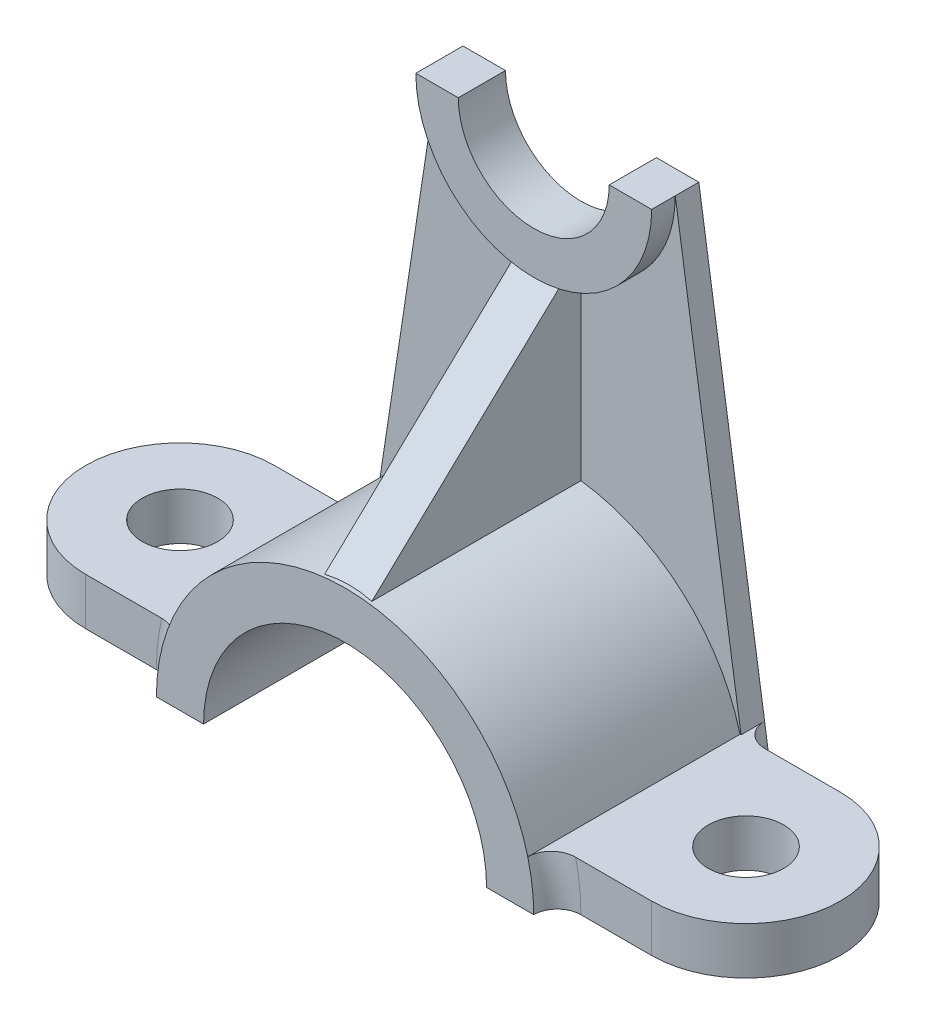
ISO-10303-21;
HEADER;
FILE_DESCRIPTION(('STEP AP214'),'2;1');
FILE_NAME('part.step','',(''),(''),'','','');
FILE_SCHEMA(('AUTOMOTIVE_DESIGN { 1 0 10303 214 1 1 1 1 }'));
ENDSEC;
DATA;
#1=APPLICATION_CONTEXT('core data for automotive mechanical design processes');
#2=APPLICATION_PROTOCOL_DEFINITION('international standard','automotive_design',2000,#1);
#3=PRODUCT_CONTEXT('',#1,'mechanical');
#4=PRODUCT('Part','Part','',(#3));
#5=PRODUCT_RELATED_PRODUCT_CATEGORY('part','',(#4));
#6=PRODUCT_DEFINITION_FORMATION('','',#4);
#7=PRODUCT_DEFINITION_CONTEXT('part definition',#1,'design');
#8=PRODUCT_DEFINITION('design','',#6,#7);
#9=PRODUCT_DEFINITION_SHAPE('','',#8);
#10=(LENGTH_UNIT() NAMED_UNIT(*) SI_UNIT(.MILLI.,.METRE.));
#11=(NAMED_UNIT(*) PLANE_ANGLE_UNIT() SI_UNIT($,.RADIAN.));
#12=(NAMED_UNIT(*) SI_UNIT($,.STERADIAN.) SOLID_ANGLE_UNIT());
#13=UNCERTAINTY_MEASURE_WITH_UNIT(LENGTH_MEASURE(1.E-05),#10,'distance_accuracy_value','');
#14=(GEOMETRIC_REPRESENTATION_CONTEXT(3) GLOBAL_UNCERTAINTY_ASSIGNED_CONTEXT((#13)) GLOBAL_UNIT_ASSIGNED_CONTEXT((#10,
#11,#12)) REPRESENTATION_CONTEXT('',''));
#15=CARTESIAN_POINT('',(0.,0.,0.));
#16=DIRECTION('',(0.,0.,1.));
#17=DIRECTION('',(1.,0.,0.));
#18=AXIS2_PLACEMENT_3D('',#15,#16,#17);
#19=CARTESIAN_POINT('',(-60.,10.,25.));
#20=DIRECTION('',(0.,-1.,0.));
#21=DIRECTION('',(0.,0.,-1.));
#22=AXIS2_PLACEMENT_3D('',#19,#20,#21);
#23=CYLINDRICAL_SURFACE('',#22,20.);
#24=DIRECTION('',(0.,-1.,0.));
#25=VECTOR('',#24,1.);
#26=CARTESIAN_POINT('',(-60.,10.,45.));
#27=LINE('',#26,#25);
#28=CARTESIAN_POINT('',(-60.,10.,45.));
#29=VERTEX_POINT('',#28);
#30=CARTESIAN_POINT('',(-60.,0.,45.));
#31=VERTEX_POINT('',#30);
#32=EDGE_CURVE('E377',#29,#31,#27,.T.);
#33=ORIENTED_EDGE('',*,*,#32,.F.);
#34=CARTESIAN_POINT('',(-60.,10.,25.));
#35=DIRECTION('',(0.,-1.,0.));
#36=DIRECTION('',(0.,0.,-1.));
#37=AXIS2_PLACEMENT_3D('',#34,#35,#36);
#38=CIRCLE('',#37,20.);
#39=CARTESIAN_POINT('',(-60.,10.,5.));
#40=VERTEX_POINT('',#39);
#41=EDGE_CURVE('E517',#40,#29,#38,.F.);
#42=ORIENTED_EDGE('',*,*,#41,.F.);
#43=DIRECTION('',(0.,-1.,0.));
#44=VECTOR('',#43,1.);
#45=CARTESIAN_POINT('',(-60.,10.,5.));
#46=LINE('',#45,#44);
#47=CARTESIAN_POINT('',(-60.,0.,5.));
#48=VERTEX_POINT('',#47);
#49=EDGE_CURVE('E520',#48,#40,#46,.F.);
#50=ORIENTED_EDGE('',*,*,#49,.F.);
#51=CARTESIAN_POINT('',(-60.,0.,25.));
#52=DIRECTION('',(0.,-1.,0.));
#53=DIRECTION('',(1.,0.,0.));
#54=AXIS2_PLACEMENT_3D('',#51,#52,#53);
#55=CIRCLE('',#54,20.);
#56=EDGE_CURVE('E515',#31,#48,#55,.T.);
#57=ORIENTED_EDGE('',*,*,#56,.F.);
#58=EDGE_LOOP('',(#33,#42,#50,#57));
#59=FACE_BOUND('',#58,.T.);
#60=ADVANCED_FACE('F35',(#59),#23,.T.);
#61=CARTESIAN_POINT('',(0.,102.,5.));
#62=DIRECTION('',(0.,0.,1.));
#63=DIRECTION('',(1.,0.,0.));
#64=AXIS2_PLACEMENT_3D('',#61,#62,#63);
#65=PLANE('',#64);
#66=DIRECTION('',(-0.149825373883582,-0.988712474554986,0.));
#67=VECTOR('',#66,1.);
#68=CARTESIAN_POINT('',(-25.,102.,5.));
#69=LINE('',#68,#67);
#70=CARTESIAN_POINT('',(-25.,102.,5.));
#71=VERTEX_POINT('',#70);
#72=CARTESIAN_POINT('',(-38.9412971435337,10.,5.));
#73=VERTEX_POINT('',#72);
#74=EDGE_CURVE('E286',#71,#73,#69,.T.);
#75=ORIENTED_EDGE('',*,*,#74,.T.);
#76=DIRECTION('',(1.,0.,0.));
#77=VECTOR('',#76,1.);
#78=CARTESIAN_POINT('',(-30.,10.,5.));
#79=LINE('',#78,#77);
#80=CARTESIAN_POINT('',(-38.7298334620742,9.99999999999999,5.));
#81=VERTEX_POINT('',#80);
#82=EDGE_CURVE('E531',#73,#81,#79,.T.);
#83=ORIENTED_EDGE('',*,*,#82,.T.);
#84=CARTESIAN_POINT('',(0.,0.,5.));
#85=DIRECTION('',(0.,0.,1.));
#86=DIRECTION('',(1.,0.,0.));
#87=AXIS2_PLACEMENT_3D('',#84,#85,#86);
#88=CIRCLE('',#87,40.);
#89=CARTESIAN_POINT('',(-5.,39.6862696659689,5.));
#90=VERTEX_POINT('',#89);
#91=EDGE_CURVE('E305',#90,#81,#88,.T.);
#92=ORIENTED_EDGE('',*,*,#91,.F.);
#93=DIRECTION('',(0.,1.,0.));
#94=VECTOR('',#93,1.);
#95=CARTESIAN_POINT('',(-5.,102.,5.));
#96=LINE('',#95,#94);
#97=CARTESIAN_POINT('',(-5.,77.5051025721682,5.));
#98=VERTEX_POINT('',#97);
#99=EDGE_CURVE('E223',#90,#98,#96,.T.);
#100=ORIENTED_EDGE('',*,*,#99,.T.);
#101=CARTESIAN_POINT('',(0.,102.,5.));
#102=DIRECTION('',(0.,0.,-1.));
#103=DIRECTION('',(1.,0.,0.));
#104=AXIS2_PLACEMENT_3D('',#101,#102,#103);
#105=CIRCLE('',#104,25.);
#106=EDGE_CURVE('E287',#98,#71,#105,.T.);
#107=ORIENTED_EDGE('',*,*,#106,.T.);
#108=EDGE_LOOP('',(#75,#83,#92,#100,#107));
#109=FACE_BOUND('',#108,.T.);
#110=ADVANCED_FACE('F400',(#109),#65,.T.);
#111=CARTESIAN_POINT('',(60.,0.,25.));
#112=DIRECTION('',(0.,-1.,0.));
#113=DIRECTION('',(0.,0.,-1.));
#114=AXIS2_PLACEMENT_3D('',#111,#112,#113);
#115=CYLINDRICAL_SURFACE('',#114,20.);
#116=DIRECTION('',(0.,-1.,0.));
#117=VECTOR('',#116,1.);
#118=CARTESIAN_POINT('',(60.,10.,45.));
#119=LINE('',#118,#117);
#120=CARTESIAN_POINT('',(60.,0.,45.));
#121=VERTEX_POINT('',#120);
#122=CARTESIAN_POINT('',(60.,10.,45.));
#123=VERTEX_POINT('',#122);
#124=EDGE_CURVE('E341',#121,#123,#119,.F.);
#125=ORIENTED_EDGE('',*,*,#124,.F.);
#126=CARTESIAN_POINT('',(60.,0.,25.));
#127=DIRECTION('',(0.,-1.,0.));
#128=DIRECTION('',(0.,0.,-1.));
#129=AXIS2_PLACEMENT_3D('',#126,#127,#128);
#130=CIRCLE('',#129,20.);
#131=CARTESIAN_POINT('',(60.,0.,5.));
#132=VERTEX_POINT('',#131);
#133=EDGE_CURVE('E347',#132,#121,#130,.T.);
#134=ORIENTED_EDGE('',*,*,#133,.F.);
#135=DIRECTION('',(0.,-1.,0.));
#136=VECTOR('',#135,1.);
#137=CARTESIAN_POINT('',(60.,10.,5.));
#138=LINE('',#137,#136);
#139=CARTESIAN_POINT('',(60.,10.,5.));
#140=VERTEX_POINT('',#139);
#141=EDGE_CURVE('E344',#140,#132,#138,.T.);
#142=ORIENTED_EDGE('',*,*,#141,.F.);
#143=CARTESIAN_POINT('',(60.,10.,25.));
#144=DIRECTION('',(0.,-1.,0.));
#145=DIRECTION('',(0.,0.,-1.));
#146=AXIS2_PLACEMENT_3D('',#143,#144,#145);
#147=CIRCLE('',#146,20.);
#148=EDGE_CURVE('E350',#123,#140,#147,.F.);
#149=ORIENTED_EDGE('',*,*,#148,.F.);
#150=EDGE_LOOP('',(#125,#134,#142,#149));
#151=FACE_BOUND('',#150,.T.);
#152=ADVANCED_FACE('F564',(#151),#115,.T.);
#153=CARTESIAN_POINT('',(0.,0.,50.));
#154=DIRECTION('',(0.,0.,-1.));
#155=DIRECTION('',(-1.,0.,0.));
#156=AXIS2_PLACEMENT_3D('',#153,#154,#155);
#157=CYLINDRICAL_SURFACE('',#156,40.);
#158=DIRECTION('',(0.,0.,-1.));
#159=VECTOR('',#158,1.);
#160=CARTESIAN_POINT('',(-38.7298334620742,10.,50.));
#161=LINE('',#160,#159);
#162=CARTESIAN_POINT('',(-38.7298334620742,10.,50.));
#163=VERTEX_POINT('',#162);
#164=EDGE_CURVE('E465',#163,#81,#161,.T.);
#165=ORIENTED_EDGE('',*,*,#164,.F.);
#166=CARTESIAN_POINT('',(0.,0.,50.));
#167=DIRECTION('',(0.,0.,1.));
#168=DIRECTION('',(1.,0.,0.));
#169=AXIS2_PLACEMENT_3D('',#166,#167,#168);
#170=CIRCLE('',#169,40.);
#171=CARTESIAN_POINT('',(38.7298334620742,10.,50.));
#172=VERTEX_POINT('',#171);
#173=EDGE_CURVE('E313',#172,#163,#170,.T.);
#174=ORIENTED_EDGE('',*,*,#173,.F.);
#175=DIRECTION('',(0.,0.,-1.));
#176=VECTOR('',#175,1.);
#177=CARTESIAN_POINT('',(38.7298334620742,10.,50.));
#178=LINE('',#177,#176);
#179=CARTESIAN_POINT('',(38.7298334620742,9.99999999999999,5.));
#180=VERTEX_POINT('',#179);
#181=EDGE_CURVE('E239',#180,#172,#178,.F.);
#182=ORIENTED_EDGE('',*,*,#181,.F.);
#183=CARTESIAN_POINT('',(5.,39.6862696659689,5.));
#184=VERTEX_POINT('',#183);
#185=EDGE_CURVE('E306',#180,#184,#88,.T.);
#186=ORIENTED_EDGE('',*,*,#185,.T.);
#187=DIRECTION('',(0.,0.,-1.));
#188=VECTOR('',#187,1.);
#189=CARTESIAN_POINT('',(5.,39.6862696659689,50.));
#190=LINE('',#189,#188);
#191=CARTESIAN_POINT('',(5.,39.6862696659689,49.3306887304653));
#192=VERTEX_POINT('',#191);
#193=EDGE_CURVE('E244',#184,#192,#190,.F.);
#194=ORIENTED_EDGE('',*,*,#193,.T.);
#195=CARTESIAN_POINT('',(0.,0.,91.1621621621622));
#196=DIRECTION('',(0.,0.725463698509217,0.688260431919));
#197=DIRECTION('',(0.,0.688260431919,-0.725463698509217));
#198=AXIS2_PLACEMENT_3D('',#195,#196,#197);
#199=ELLIPSE('',#198,58.1175353760675,40.);
#200=CARTESIAN_POINT('',(-5.,39.6862696659689,49.3306887304653));
#201=VERTEX_POINT('',#200);
#202=EDGE_CURVE('E233',#192,#201,#199,.T.);
#203=ORIENTED_EDGE('',*,*,#202,.T.);
#204=DIRECTION('',(0.,0.,-1.));
#205=VECTOR('',#204,1.);
#206=CARTESIAN_POINT('',(-5.,39.6862696659689,50.));
#207=LINE('',#206,#205);
#208=EDGE_CURVE('E217',#90,#201,#207,.F.);
#209=ORIENTED_EDGE('',*,*,#208,.F.);
#210=ORIENTED_EDGE('',*,*,#91,.T.);
#211=EDGE_LOOP('',(#165,#174,#182,#186,#194,#203,#209,#210));
#212=FACE_BOUND('',#211,.T.);
#213=ADVANCED_FACE('F242',(#212),#157,.T.);
#214=ORIENTED_EDGE('',*,*,#185,.F.);
#215=DIRECTION('',(-1.,0.,0.));
#216=VECTOR('',#215,1.);
#217=CARTESIAN_POINT('',(30.,10.,5.));
#218=LINE('',#217,#216);
#219=CARTESIAN_POINT('',(38.9412971435337,10.,5.));
#220=VERTEX_POINT('',#219);
#221=EDGE_CURVE('E470',#220,#180,#218,.T.);
#222=ORIENTED_EDGE('',*,*,#221,.F.);
#223=DIRECTION('',(-0.149825373883582,0.988712474554986,0.));
#224=VECTOR('',#223,1.);
#225=CARTESIAN_POINT('',(25.,102.,5.));
#226=LINE('',#225,#224);
#227=CARTESIAN_POINT('',(25.,102.,5.));
#228=VERTEX_POINT('',#227);
#229=EDGE_CURVE('E290',#220,#228,#226,.T.);
#230=ORIENTED_EDGE('',*,*,#229,.T.);
#231=CARTESIAN_POINT('',(5.,77.5051025721682,5.));
#232=VERTEX_POINT('',#231);
#233=EDGE_CURVE('E283',#228,#232,#105,.T.);
#234=ORIENTED_EDGE('',*,*,#233,.T.);
#235=DIRECTION('',(0.,1.,0.));
#236=VECTOR('',#235,1.);
#237=CARTESIAN_POINT('',(5.,102.,5.));
#238=LINE('',#237,#236);
#239=EDGE_CURVE('E228',#184,#232,#238,.T.);
#240=ORIENTED_EDGE('',*,*,#239,.F.);
#241=EDGE_LOOP('',(#214,#222,#230,#234,#240));
#242=FACE_BOUND('',#241,.T.);
#243=ADVANCED_FACE('F558',(#242),#65,.T.);
#244=CARTESIAN_POINT('',(0.,102.,-55.9016994374948));
#245=DIRECTION('',(0.,0.,1.));
#246=DIRECTION('',(1.,0.,0.));
#247=AXIS2_PLACEMENT_3D('',#244,#245,#246);
#248=CYLINDRICAL_SURFACE('',#247,25.);
#249=DIRECTION('',(0.,0.,1.));
#250=VECTOR('',#249,1.);
#251=CARTESIAN_POINT('',(5.,77.5051025721682,-55.9016994374948));
#252=LINE('',#251,#250);
#253=CARTESIAN_POINT('',(5.,77.5051025721682,9.46759458609296));
#254=VERTEX_POINT('',#253);
#255=EDGE_CURVE('E339',#232,#254,#252,.T.);
#256=ORIENTED_EDGE('',*,*,#255,.F.);
#257=ORIENTED_EDGE('',*,*,#233,.F.);
#258=DIRECTION('',(0.,0.,1.));
#259=VECTOR('',#258,1.);
#260=CARTESIAN_POINT('',(25.,102.,-55.9016994374948));
#261=LINE('',#260,#259);
#262=CARTESIAN_POINT('',(25.,102.,10.));
#263=VERTEX_POINT('',#262);
#264=EDGE_CURVE('E265',#228,#263,#261,.T.);
#265=ORIENTED_EDGE('',*,*,#264,.T.);
#266=CARTESIAN_POINT('',(0.,102.,10.));
#267=DIRECTION('',(0.,0.,1.));
#268=DIRECTION('',(1.,0.,0.));
#269=AXIS2_PLACEMENT_3D('',#266,#267,#268);
#270=CIRCLE('',#269,25.);
#271=CARTESIAN_POINT('',(0.,77.,10.));
#272=VERTEX_POINT('',#271);
#273=EDGE_CURVE('E252',#272,#263,#270,.T.);
#274=ORIENTED_EDGE('',*,*,#273,.F.);
#275=CARTESIAN_POINT('',(0.,102.,-16.3513513513514));
#276=DIRECTION('',(0.,0.725463698509217,0.688260431919));
#277=DIRECTION('',(0.,-0.688260431919,0.725463698509217));
#278=AXIS2_PLACEMENT_3D('',#275,#276,#277);
#279=ELLIPSE('',#278,36.3234596100422,25.);
#280=EDGE_CURVE('E247',#254,#272,#279,.F.);
#281=ORIENTED_EDGE('',*,*,#280,.F.);
#282=EDGE_LOOP('',(#256,#257,#265,#274,#281));
#283=FACE_BOUND('',#282,.T.);
#284=ADVANCED_FACE('F490',(#283),#248,.T.);
#285=CARTESIAN_POINT('',(-30.,0.,50.));
#286=DIRECTION('',(0.,-1.,0.));
#287=DIRECTION('',(1.,0.,0.));
#288=AXIS2_PLACEMENT_3D('',#285,#286,#287);
#289=PLANE('',#288);
#290=CARTESIAN_POINT('',(-60.,0.,25.));
#291=DIRECTION('',(0.,-1.,0.));
#292=DIRECTION('',(0.,0.,1.));
#293=AXIS2_PLACEMENT_3D('',#290,#291,#292);
#294=CIRCLE('',#293,8.00000000000001);
#295=CARTESIAN_POINT('',(-60.,0.,33.));
#296=VERTEX_POINT('',#295);
#297=EDGE_CURVE('E535',#296,#296,#294,.T.);
#298=ORIENTED_EDGE('',*,*,#297,.F.);
#299=EDGE_LOOP('',(#298));
#300=FACE_BOUND('',#299,.T.);
#301=DIRECTION('',(-1.,0.,0.));
#302=VECTOR('',#301,1.);
#303=CARTESIAN_POINT('',(-30.,0.,50.));
#304=LINE('',#303,#302);
#305=CARTESIAN_POINT('',(-30.,0.,50.));
#306=VERTEX_POINT('',#305);
#307=CARTESIAN_POINT('',(-40.,0.,50.));
#308=VERTEX_POINT('',#307);
#309=EDGE_CURVE('E312',#306,#308,#304,.T.);
#310=ORIENTED_EDGE('',*,*,#309,.T.);
#311=CARTESIAN_POINT('',(-45.,0.,50.));
#312=DIRECTION('',(0.,-1.,0.));
#313=DIRECTION('',(1.,0.,0.));
#314=AXIS2_PLACEMENT_3D('',#311,#312,#313);
#315=CIRCLE('',#314,5.);
#316=CARTESIAN_POINT('',(-45.,0.,45.));
#317=VERTEX_POINT('',#316);
#318=EDGE_CURVE('E45',#308,#317,#315,.F.);
#319=ORIENTED_EDGE('',*,*,#318,.T.);
#320=DIRECTION('',(-1.,0.,0.));
#321=VECTOR('',#320,1.);
#322=CARTESIAN_POINT('',(-30.,0.,45.));
#323=LINE('',#322,#321);
#324=EDGE_CURVE('E524',#317,#31,#323,.T.);
#325=ORIENTED_EDGE('',*,*,#324,.T.);
#326=ORIENTED_EDGE('',*,*,#56,.T.);
#327=DIRECTION('',(1.,0.,0.));
#328=VECTOR('',#327,1.);
#329=CARTESIAN_POINT('',(-30.,0.,5.));
#330=LINE('',#329,#328);
#331=CARTESIAN_POINT('',(-45.,0.,5.));
#332=VERTEX_POINT('',#331);
#333=EDGE_CURVE('E530',#48,#332,#330,.T.);
#334=ORIENTED_EDGE('',*,*,#333,.T.);
#335=CARTESIAN_POINT('',(-45.,0.,0.));
#336=DIRECTION('',(0.,-1.,0.));
#337=DIRECTION('',(1.,0.,0.));
#338=AXIS2_PLACEMENT_3D('',#335,#336,#337);
#339=CIRCLE('',#338,5.);
#340=CARTESIAN_POINT('',(-40.,0.,0.));
#341=VERTEX_POINT('',#340);
#342=EDGE_CURVE('E418',#332,#341,#339,.F.);
#343=ORIENTED_EDGE('',*,*,#342,.T.);
#344=DIRECTION('',(-1.,0.,0.));
#345=VECTOR('',#344,1.);
#346=CARTESIAN_POINT('',(-30.,0.,0.));
#347=LINE('',#346,#345);
#348=CARTESIAN_POINT('',(-30.,0.,0.));
#349=VERTEX_POINT('',#348);
#350=EDGE_CURVE('E325',#349,#341,#347,.T.);
#351=ORIENTED_EDGE('',*,*,#350,.F.);
#352=DIRECTION('',(0.,0.,-1.));
#353=VECTOR('',#352,1.);
#354=CARTESIAN_POINT('',(-30.,0.,50.));
#355=LINE('',#354,#353);
#356=EDGE_CURVE('E335',#306,#349,#355,.T.);
#357=ORIENTED_EDGE('',*,*,#356,.F.);
#358=EDGE_LOOP('',(#310,#319,#325,#326,#334,#343,#351,#357));
#359=FACE_BOUND('',#358,.T.);
#360=ADVANCED_FACE('F529',(#300,#359),#289,.T.);
#361=CARTESIAN_POINT('',(0.,0.,50.));
#362=DIRECTION('',(0.,0.,-1.));
#363=DIRECTION('',(-1.,0.,0.));
#364=AXIS2_PLACEMENT_3D('',#361,#362,#363);
#365=CYLINDRICAL_SURFACE('',#364,30.);
#366=CARTESIAN_POINT('',(0.,0.,50.));
#367=DIRECTION('',(0.,0.,1.));
#368=DIRECTION('',(1.,0.,0.));
#369=AXIS2_PLACEMENT_3D('',#366,#367,#368);
#370=CIRCLE('',#369,30.);
#371=CARTESIAN_POINT('',(30.,0.,50.));
#372=VERTEX_POINT('',#371);
#373=EDGE_CURVE('E316',#372,#306,#370,.T.);
#374=ORIENTED_EDGE('',*,*,#373,.T.);
#375=ORIENTED_EDGE('',*,*,#356,.T.);
#376=CARTESIAN_POINT('',(0.,0.,0.));
#377=DIRECTION('',(0.,0.,1.));
#378=DIRECTION('',(1.,0.,0.));
#379=AXIS2_PLACEMENT_3D('',#376,#377,#378);
#380=CIRCLE('',#379,30.);
#381=CARTESIAN_POINT('',(30.,0.,0.));
#382=VERTEX_POINT('',#381);
#383=EDGE_CURVE('E328',#382,#349,#380,.T.);
#384=ORIENTED_EDGE('',*,*,#383,.F.);
#385=DIRECTION('',(0.,0.,-1.));
#386=VECTOR('',#385,1.);
#387=CARTESIAN_POINT('',(30.,0.,50.));
#388=LINE('',#387,#386);
#389=EDGE_CURVE('E321',#372,#382,#388,.T.);
#390=ORIENTED_EDGE('',*,*,#389,.F.);
#391=EDGE_LOOP('',(#374,#375,#384,#390));
#392=FACE_BOUND('',#391,.T.);
#393=ADVANCED_FACE('F549',(#392),#365,.F.);
#394=CARTESIAN_POINT('',(40.,0.,50.));
#395=DIRECTION('',(0.,-1.,0.));
#396=DIRECTION('',(0.,0.,-1.));
#397=AXIS2_PLACEMENT_3D('',#394,#395,#396);
#398=PLANE('',#397);
#399=CARTESIAN_POINT('',(60.,0.,25.));
#400=DIRECTION('',(0.,1.,0.));
#401=DIRECTION('',(0.,0.,1.));
#402=AXIS2_PLACEMENT_3D('',#399,#400,#401);
#403=CIRCLE('',#402,8.00000000000001);
#404=CARTESIAN_POINT('',(60.,0.,33.));
#405=VERTEX_POINT('',#404);
#406=EDGE_CURVE('E456',#405,#405,#403,.T.);
#407=ORIENTED_EDGE('',*,*,#406,.T.);
#408=EDGE_LOOP('',(#407));
#409=FACE_BOUND('',#408,.T.);
#410=DIRECTION('',(-1.,0.,0.));
#411=VECTOR('',#410,1.);
#412=CARTESIAN_POINT('',(30.,0.,5.));
#413=LINE('',#412,#411);
#414=CARTESIAN_POINT('',(45.,0.,5.));
#415=VERTEX_POINT('',#414);
#416=EDGE_CURVE('E471',#132,#415,#413,.T.);
#417=ORIENTED_EDGE('',*,*,#416,.F.);
#418=ORIENTED_EDGE('',*,*,#133,.T.);
#419=DIRECTION('',(1.,0.,0.));
#420=VECTOR('',#419,1.);
#421=CARTESIAN_POINT('',(30.,0.,45.));
#422=LINE('',#421,#420);
#423=CARTESIAN_POINT('',(45.,0.,45.));
#424=VERTEX_POINT('',#423);
#425=EDGE_CURVE('E462',#424,#121,#422,.T.);
#426=ORIENTED_EDGE('',*,*,#425,.F.);
#427=CARTESIAN_POINT('',(45.,0.,50.));
#428=DIRECTION('',(0.,-1.,0.));
#429=DIRECTION('',(0.,0.,-1.));
#430=AXIS2_PLACEMENT_3D('',#427,#428,#429);
#431=CIRCLE('',#430,5.);
#432=CARTESIAN_POINT('',(40.,0.,50.));
#433=VERTEX_POINT('',#432);
#434=EDGE_CURVE('E367',#424,#433,#431,.F.);
#435=ORIENTED_EDGE('',*,*,#434,.T.);
#436=DIRECTION('',(-1.,0.,0.));
#437=VECTOR('',#436,1.);
#438=CARTESIAN_POINT('',(40.,0.,50.));
#439=LINE('',#438,#437);
#440=EDGE_CURVE('E318',#433,#372,#439,.T.);
#441=ORIENTED_EDGE('',*,*,#440,.T.);
#442=ORIENTED_EDGE('',*,*,#389,.T.);
#443=DIRECTION('',(-1.,0.,0.));
#444=VECTOR('',#443,1.);
#445=CARTESIAN_POINT('',(40.,0.,0.));
#446=LINE('',#445,#444);
#447=CARTESIAN_POINT('',(40.,0.,0.));
#448=VERTEX_POINT('',#447);
#449=EDGE_CURVE('E331',#448,#382,#446,.T.);
#450=ORIENTED_EDGE('',*,*,#449,.F.);
#451=CARTESIAN_POINT('',(45.,0.,0.));
#452=DIRECTION('',(0.,-1.,0.));
#453=DIRECTION('',(0.,0.,-1.));
#454=AXIS2_PLACEMENT_3D('',#451,#452,#453);
#455=CIRCLE('',#454,5.);
#456=EDGE_CURVE('E365',#448,#415,#455,.F.);
#457=ORIENTED_EDGE('',*,*,#456,.T.);
#458=EDGE_LOOP('',(#417,#418,#426,#435,#441,#442,#450,#457));
#459=FACE_BOUND('',#458,.T.);
#460=ADVANCED_FACE('F555',(#409,#459),#398,.T.);
#461=CARTESIAN_POINT('',(0.,0.,50.));
#462=DIRECTION('',(0.,0.,1.));
#463=DIRECTION('',(1.,0.,0.));
#464=AXIS2_PLACEMENT_3D('',#461,#462,#463);
#465=PLANE('',#464);
#466=ORIENTED_EDGE('',*,*,#309,.F.);
#467=ORIENTED_EDGE('',*,*,#373,.F.);
#468=ORIENTED_EDGE('',*,*,#440,.F.);
#469=EDGE_CURVE('E309',#433,#172,#170,.T.);
#470=ORIENTED_EDGE('',*,*,#469,.T.);
#471=ORIENTED_EDGE('',*,*,#173,.T.);
#472=EDGE_CURVE('E314',#163,#308,#170,.T.);
#473=ORIENTED_EDGE('',*,*,#472,.T.);
#474=EDGE_LOOP('',(#466,#467,#468,#470,#471,#473));
#475=FACE_BOUND('',#474,.T.);
#476=ADVANCED_FACE('F591',(#475),#465,.T.);
#477=CARTESIAN_POINT('',(0.,0.,0.));
#478=DIRECTION('',(0.,0.,1.));
#479=DIRECTION('',(1.,0.,0.));
#480=AXIS2_PLACEMENT_3D('',#477,#478,#479);
#481=PLANE('',#480);
#482=DIRECTION('',(-1.,0.,0.));
#483=VECTOR('',#482,1.);
#484=CARTESIAN_POINT('',(-25.,102.,0.));
#485=LINE('',#484,#483);
#486=CARTESIAN_POINT('',(-16.,102.,0.));
#487=VERTEX_POINT('',#486);
#488=CARTESIAN_POINT('',(-25.,102.,0.));
#489=VERTEX_POINT('',#488);
#490=EDGE_CURVE('E268',#487,#489,#485,.T.);
#491=ORIENTED_EDGE('',*,*,#490,.F.);
#492=CARTESIAN_POINT('',(0.,102.,0.));
#493=DIRECTION('',(0.,0.,1.));
#494=DIRECTION('',(1.,0.,0.));
#495=AXIS2_PLACEMENT_3D('',#492,#493,#494);
#496=CIRCLE('',#495,16.);
#497=CARTESIAN_POINT('',(16.,102.,0.));
#498=VERTEX_POINT('',#497);
#499=EDGE_CURVE('E266',#498,#487,#496,.F.);
#500=ORIENTED_EDGE('',*,*,#499,.F.);
#501=DIRECTION('',(-1.,0.,0.));
#502=VECTOR('',#501,1.);
#503=CARTESIAN_POINT('',(16.,102.,0.));
#504=LINE('',#503,#502);
#505=CARTESIAN_POINT('',(25.,102.,0.));
#506=VERTEX_POINT('',#505);
#507=EDGE_CURVE('E269',#506,#498,#504,.T.);
#508=ORIENTED_EDGE('',*,*,#507,.F.);
#509=DIRECTION('',(-0.149825373883582,0.988712474554986,0.));
#510=VECTOR('',#509,1.);
#511=CARTESIAN_POINT('',(25.,102.,0.));
#512=LINE('',#511,#510);
#513=CARTESIAN_POINT('',(38.9412971435337,9.99999999999999,0.));
#514=VERTEX_POINT('',#513);
#515=EDGE_CURVE('E296',#514,#506,#512,.T.);
#516=ORIENTED_EDGE('',*,*,#515,.F.);
#517=CARTESIAN_POINT('',(39.5484989821995,5.99301495534328,0.));
#518=VERTEX_POINT('',#517);
#519=EDGE_CURVE('E297',#518,#514,#512,.T.);
#520=ORIENTED_EDGE('',*,*,#519,.F.);
#521=CARTESIAN_POINT('',(0.,0.,0.));
#522=DIRECTION('',(0.,0.,1.));
#523=DIRECTION('',(1.,0.,0.));
#524=AXIS2_PLACEMENT_3D('',#521,#522,#523);
#525=CIRCLE('',#524,40.);
#526=EDGE_CURVE('E322',#448,#518,#525,.T.);
#527=ORIENTED_EDGE('',*,*,#526,.F.);
#528=ORIENTED_EDGE('',*,*,#449,.T.);
#529=ORIENTED_EDGE('',*,*,#383,.T.);
#530=ORIENTED_EDGE('',*,*,#350,.T.);
#531=CARTESIAN_POINT('',(-39.5484989821995,5.99301495534327,0.));
#532=VERTEX_POINT('',#531);
#533=EDGE_CURVE('E308',#532,#341,#525,.T.);
#534=ORIENTED_EDGE('',*,*,#533,.F.);
#535=DIRECTION('',(-0.149825373883582,-0.988712474554986,0.));
#536=VECTOR('',#535,1.);
#537=CARTESIAN_POINT('',(-25.,102.,0.));
#538=LINE('',#537,#536);
#539=CARTESIAN_POINT('',(-38.9412971435337,10.,0.));
#540=VERTEX_POINT('',#539);
#541=EDGE_CURVE('E272',#540,#532,#538,.T.);
#542=ORIENTED_EDGE('',*,*,#541,.F.);
#543=EDGE_CURVE('E293',#489,#540,#538,.T.);
#544=ORIENTED_EDGE('',*,*,#543,.F.);
#545=EDGE_LOOP('',(#491,#500,#508,#516,#520,#527,#528,#529,#530,#534,#542,#544));
#546=FACE_BOUND('',#545,.T.);
#547=ADVANCED_FACE('F580',(#546),#481,.F.);
#548=CARTESIAN_POINT('',(-25.,102.,5.));
#549=DIRECTION('',(0.988712474554987,-0.149825373883582,0.));
#550=DIRECTION('',(0.149825373883582,0.988712474554987,0.));
#551=AXIS2_PLACEMENT_3D('',#548,#549,#550);
#552=PLANE('',#551);
#553=ORIENTED_EDGE('',*,*,#543,.T.);
#554=DIRECTION('',(0.,0.,1.));
#555=VECTOR('',#554,1.);
#556=CARTESIAN_POINT('',(-38.9412971435337,10.,0.));
#557=LINE('',#556,#555);
#558=EDGE_CURVE('E506',#540,#73,#557,.T.);
#559=ORIENTED_EDGE('',*,*,#558,.T.);
#560=ORIENTED_EDGE('',*,*,#74,.F.);
#561=DIRECTION('',(0.,0.,-1.));
#562=VECTOR('',#561,1.);
#563=CARTESIAN_POINT('',(-25.,102.,5.));
#564=LINE('',#563,#562);
#565=EDGE_CURVE('E302',#71,#489,#564,.T.);
#566=ORIENTED_EDGE('',*,*,#565,.T.);
#567=EDGE_LOOP('',(#553,#559,#560,#566));
#568=FACE_BOUND('',#567,.T.);
#569=ADVANCED_FACE('F505',(#568),#552,.F.);
#570=CARTESIAN_POINT('',(25.,102.,5.));
#571=DIRECTION('',(-0.988712474554987,-0.149825373883582,0.));
#572=DIRECTION('',(0.149825373883582,-0.988712474554987,0.));
#573=AXIS2_PLACEMENT_3D('',#570,#571,#572);
#574=PLANE('',#573);
#575=ORIENTED_EDGE('',*,*,#229,.F.);
#576=DIRECTION('',(0.,0.,-1.));
#577=VECTOR('',#576,1.);
#578=CARTESIAN_POINT('',(38.9412971435337,10.,0.));
#579=LINE('',#578,#577);
#580=EDGE_CURVE('E357',#220,#514,#579,.T.);
#581=ORIENTED_EDGE('',*,*,#580,.T.);
#582=ORIENTED_EDGE('',*,*,#515,.T.);
#583=DIRECTION('',(0.,0.,-1.));
#584=VECTOR('',#583,1.);
#585=CARTESIAN_POINT('',(25.,102.,5.));
#586=LINE('',#585,#584);
#587=EDGE_CURVE('E292',#228,#506,#586,.T.);
#588=ORIENTED_EDGE('',*,*,#587,.F.);
#589=EDGE_LOOP('',(#575,#581,#582,#588));
#590=FACE_BOUND('',#589,.T.);
#591=ADVANCED_FACE('F609',(#590),#574,.F.);
#592=CARTESIAN_POINT('',(16.,102.,-55.9016994374948));
#593=DIRECTION('',(0.,-1.,0.));
#594=DIRECTION('',(0.,0.,-1.));
#595=AXIS2_PLACEMENT_3D('',#592,#593,#594);
#596=PLANE('',#595);
#597=ORIENTED_EDGE('',*,*,#587,.T.);
#598=ORIENTED_EDGE('',*,*,#507,.T.);
#599=DIRECTION('',(0.,0.,1.));
#600=VECTOR('',#599,1.);
#601=CARTESIAN_POINT('',(16.,102.,-55.9016994374948));
#602=LINE('',#601,#600);
#603=CARTESIAN_POINT('',(16.,102.,10.));
#604=VERTEX_POINT('',#603);
#605=EDGE_CURVE('E277',#498,#604,#602,.T.);
#606=ORIENTED_EDGE('',*,*,#605,.T.);
#607=DIRECTION('',(1.,0.,0.));
#608=VECTOR('',#607,1.);
#609=CARTESIAN_POINT('',(16.,102.,10.));
#610=LINE('',#609,#608);
#611=EDGE_CURVE('E256',#604,#263,#610,.T.);
#612=ORIENTED_EDGE('',*,*,#611,.T.);
#613=ORIENTED_EDGE('',*,*,#264,.F.);
#614=EDGE_LOOP('',(#597,#598,#606,#612,#613));
#615=FACE_BOUND('',#614,.T.);
#616=ADVANCED_FACE('F605',(#615),#596,.F.);
#617=CARTESIAN_POINT('',(0.,102.,-55.9016994374948));
#618=DIRECTION('',(0.,0.,1.));
#619=DIRECTION('',(1.,0.,0.));
#620=AXIS2_PLACEMENT_3D('',#617,#618,#619);
#621=CYLINDRICAL_SURFACE('',#620,16.);
#622=ORIENTED_EDGE('',*,*,#499,.T.);
#623=DIRECTION('',(0.,0.,1.));
#624=VECTOR('',#623,1.);
#625=CARTESIAN_POINT('',(-16.,102.,-55.9016994374948));
#626=LINE('',#625,#624);
#627=CARTESIAN_POINT('',(-16.,102.,10.));
#628=VERTEX_POINT('',#627);
#629=EDGE_CURVE('E275',#487,#628,#626,.T.);
#630=ORIENTED_EDGE('',*,*,#629,.T.);
#631=CARTESIAN_POINT('',(0.,102.,10.));
#632=DIRECTION('',(0.,0.,1.));
#633=DIRECTION('',(1.,0.,0.));
#634=AXIS2_PLACEMENT_3D('',#631,#632,#633);
#635=CIRCLE('',#634,16.);
#636=EDGE_CURVE('E259',#628,#604,#635,.T.);
#637=ORIENTED_EDGE('',*,*,#636,.T.);
#638=ORIENTED_EDGE('',*,*,#605,.F.);
#639=EDGE_LOOP('',(#622,#630,#637,#638));
#640=FACE_BOUND('',#639,.T.);
#641=ADVANCED_FACE('F603',(#640),#621,.F.);
#642=CARTESIAN_POINT('',(-25.,102.,-55.9016994374948));
#643=DIRECTION('',(0.,-1.,0.));
#644=DIRECTION('',(0.,0.,-1.));
#645=AXIS2_PLACEMENT_3D('',#642,#643,#644);
#646=PLANE('',#645);
#647=ORIENTED_EDGE('',*,*,#629,.F.);
#648=ORIENTED_EDGE('',*,*,#490,.T.);
#649=ORIENTED_EDGE('',*,*,#565,.F.);
#650=DIRECTION('',(0.,0.,1.));
#651=VECTOR('',#650,1.);
#652=CARTESIAN_POINT('',(-25.,102.,-55.9016994374948));
#653=LINE('',#652,#651);
#654=CARTESIAN_POINT('',(-25.,102.,10.));
#655=VERTEX_POINT('',#654);
#656=EDGE_CURVE('E273',#71,#655,#653,.T.);
#657=ORIENTED_EDGE('',*,*,#656,.T.);
#658=DIRECTION('',(1.,0.,0.));
#659=VECTOR('',#658,1.);
#660=CARTESIAN_POINT('',(-25.,102.,10.));
#661=LINE('',#660,#659);
#662=EDGE_CURVE('E262',#655,#628,#661,.T.);
#663=ORIENTED_EDGE('',*,*,#662,.T.);
#664=EDGE_LOOP('',(#647,#648,#649,#657,#663));
#665=FACE_BOUND('',#664,.T.);
#666=ADVANCED_FACE('F499',(#665),#646,.F.);
#667=CARTESIAN_POINT('',(-5.,77.5051025721682,9.46759458609296));
#668=VERTEX_POINT('',#667);
#669=EDGE_CURVE('E236',#272,#668,#279,.F.);
#670=ORIENTED_EDGE('',*,*,#669,.F.);
#671=EDGE_CURVE('E253',#655,#272,#270,.T.);
#672=ORIENTED_EDGE('',*,*,#671,.F.);
#673=ORIENTED_EDGE('',*,*,#656,.F.);
#674=ORIENTED_EDGE('',*,*,#106,.F.);
#675=DIRECTION('',(0.,0.,1.));
#676=VECTOR('',#675,1.);
#677=CARTESIAN_POINT('',(-5.,77.5051025721682,-55.9016994374948));
#678=LINE('',#677,#676);
#679=EDGE_CURVE('E337',#98,#668,#678,.T.);
#680=ORIENTED_EDGE('',*,*,#679,.T.);
#681=EDGE_LOOP('',(#670,#672,#673,#674,#680));
#682=FACE_BOUND('',#681,.T.);
#683=ADVANCED_FACE('F486',(#682),#248,.T.);
#684=CARTESIAN_POINT('',(0.,102.,10.));
#685=DIRECTION('',(0.,0.,1.));
#686=DIRECTION('',(1.,0.,0.));
#687=AXIS2_PLACEMENT_3D('',#684,#685,#686);
#688=PLANE('',#687);
#689=ORIENTED_EDGE('',*,*,#671,.T.);
#690=ORIENTED_EDGE('',*,*,#273,.T.);
#691=ORIENTED_EDGE('',*,*,#611,.F.);
#692=ORIENTED_EDGE('',*,*,#636,.F.);
#693=ORIENTED_EDGE('',*,*,#662,.F.);
#694=EDGE_LOOP('',(#689,#690,#691,#692,#693));
#695=FACE_BOUND('',#694,.T.);
#696=ADVANCED_FACE('F495',(#695),#688,.T.);
#697=CARTESIAN_POINT('',(5.,51.,25.));
#698=DIRECTION('',(1.,0.,0.));
#699=DIRECTION('',(0.,0.,-1.));
#700=AXIS2_PLACEMENT_3D('',#697,#698,#699);
#701=PLANE('',#700);
#702=ORIENTED_EDGE('',*,*,#193,.F.);
#703=ORIENTED_EDGE('',*,*,#239,.T.);
#704=ORIENTED_EDGE('',*,*,#255,.T.);
#705=DIRECTION('',(0.,-0.688260431919,0.725463698509217));
#706=VECTOR('',#705,1.);
#707=CARTESIAN_POINT('',(5.,77.,10.));
#708=LINE('',#707,#706);
#709=EDGE_CURVE('E238',#254,#192,#708,.T.);
#710=ORIENTED_EDGE('',*,*,#709,.T.);
#711=EDGE_LOOP('',(#702,#703,#704,#710));
#712=FACE_BOUND('',#711,.T.);
#713=ADVANCED_FACE('F635',(#712),#701,.T.);
#714=CARTESIAN_POINT('',(-5.,51.,25.));
#715=DIRECTION('',(1.,0.,0.));
#716=DIRECTION('',(0.,0.,-1.));
#717=AXIS2_PLACEMENT_3D('',#714,#715,#716);
#718=PLANE('',#717);
#719=ORIENTED_EDGE('',*,*,#99,.F.);
#720=ORIENTED_EDGE('',*,*,#208,.T.);
#721=DIRECTION('',(0.,-0.688260431919,0.725463698509217));
#722=VECTOR('',#721,1.);
#723=CARTESIAN_POINT('',(-5.,77.,10.));
#724=LINE('',#723,#722);
#725=EDGE_CURVE('E220',#668,#201,#724,.T.);
#726=ORIENTED_EDGE('',*,*,#725,.F.);
#727=ORIENTED_EDGE('',*,*,#679,.F.);
#728=EDGE_LOOP('',(#719,#720,#726,#727));
#729=FACE_BOUND('',#728,.T.);
#730=ADVANCED_FACE('F219',(#729),#718,.F.);
#731=CARTESIAN_POINT('',(0.,77.,10.));
#732=DIRECTION('',(0.,0.725463698509217,0.688260431919));
#733=DIRECTION('',(0.,-0.688260431919,0.725463698509217));
#734=AXIS2_PLACEMENT_3D('',#731,#732,#733);
#735=PLANE('',#734);
#736=ORIENTED_EDGE('',*,*,#202,.F.);
#737=ORIENTED_EDGE('',*,*,#709,.F.);
#738=ORIENTED_EDGE('',*,*,#280,.T.);
#739=ORIENTED_EDGE('',*,*,#669,.T.);
#740=ORIENTED_EDGE('',*,*,#725,.T.);
#741=EDGE_LOOP('',(#736,#737,#738,#739,#740));
#742=FACE_BOUND('',#741,.T.);
#743=ADVANCED_FACE('F231',(#742),#735,.T.);
#744=CARTESIAN_POINT('',(30.,10.,45.));
#745=DIRECTION('',(0.,0.,-1.));
#746=DIRECTION('',(-1.,0.,0.));
#747=AXIS2_PLACEMENT_3D('',#744,#745,#746);
#748=PLANE('',#747);
#749=DIRECTION('',(1.,0.,0.));
#750=VECTOR('',#749,1.);
#751=CARTESIAN_POINT('',(30.,10.,45.));
#752=LINE('',#751,#750);
#753=CARTESIAN_POINT('',(43.8748219369606,10.,45.));
#754=VERTEX_POINT('',#753);
#755=EDGE_CURVE('E468',#754,#123,#752,.T.);
#756=ORIENTED_EDGE('',*,*,#755,.F.);
#757=CARTESIAN_POINT('',(0.,0.,45.));
#758=DIRECTION('',(0.,0.,-1.));
#759=DIRECTION('',(-1.,0.,0.));
#760=AXIS2_PLACEMENT_3D('',#757,#758,#759);
#761=CIRCLE('',#760,45.);
#762=EDGE_CURVE('E360',#754,#424,#761,.T.);
#763=ORIENTED_EDGE('',*,*,#762,.T.);
#764=ORIENTED_EDGE('',*,*,#425,.T.);
#765=ORIENTED_EDGE('',*,*,#124,.T.);
#766=EDGE_LOOP('',(#756,#763,#764,#765));
#767=FACE_BOUND('',#766,.T.);
#768=ADVANCED_FACE('F623',(#767),#748,.F.);
#769=CARTESIAN_POINT('',(0.,10.,0.));
#770=DIRECTION('',(0.,-1.,0.));
#771=DIRECTION('',(0.,0.,-1.));
#772=AXIS2_PLACEMENT_3D('',#769,#770,#771);
#773=PLANE('',#772);
#774=CARTESIAN_POINT('',(60.,10.,25.));
#775=DIRECTION('',(0.,1.,0.));
#776=DIRECTION('',(0.,0.,1.));
#777=AXIS2_PLACEMENT_3D('',#774,#775,#776);
#778=CIRCLE('',#777,8.00000000000001);
#779=CARTESIAN_POINT('',(60.,10.,33.));
#780=VERTEX_POINT('',#779);
#781=EDGE_CURVE('E459',#780,#780,#778,.T.);
#782=ORIENTED_EDGE('',*,*,#781,.F.);
#783=EDGE_LOOP('',(#782));
#784=FACE_BOUND('',#783,.T.);
#785=ORIENTED_EDGE('',*,*,#181,.T.);
#786=CARTESIAN_POINT('',(38.7298334620742,10.,50.));
#787=CARTESIAN_POINT('',(38.729815187931,10.,49.8624855552488));
#788=CARTESIAN_POINT('',(38.7356917880681,10.,49.7249751364253));
#789=CARTESIAN_POINT('',(38.7591015581506,10.,49.4509659437189));
#790=CARTESIAN_POINT('',(38.7766333396395,10.,49.3144670512932));
#791=CARTESIAN_POINT('',(38.8231809499102,10.,49.0436804961122));
#792=CARTESIAN_POINT('',(38.8521773025757,10.,48.9093894835041));
#793=CARTESIAN_POINT('',(38.9213994560304,10.,48.6437348052964));
#794=CARTESIAN_POINT('',(38.9616252765757,10.,48.5123711448473));
#795=CARTESIAN_POINT('',(39.0529646662099,10.,48.2534974377728));
#796=CARTESIAN_POINT('',(39.1040774715066,10.,48.1259871215267));
#797=CARTESIAN_POINT('',(39.2167904255128,10.,47.8756346513488));
#798=CARTESIAN_POINT('',(39.2783944443127,10.,47.7527942406216));
#799=CARTESIAN_POINT('',(39.4115608965917,10.,47.5126849821522));
#800=CARTESIAN_POINT('',(39.4831203986429,10.,47.3954145079078));
#801=CARTESIAN_POINT('',(39.6356795857289,10.,47.1671237206204));
#802=CARTESIAN_POINT('',(39.7166827988653,10.,47.0561057665934));
#803=CARTESIAN_POINT('',(39.8887157456235,10.,46.8395280772533));
#804=CARTESIAN_POINT('',(39.9798722191635,10.,46.7340690125896));
#805=CARTESIAN_POINT('',(40.1705860196701,10.,46.530976282545));
#806=CARTESIAN_POINT('',(40.2701464343454,10.,46.4333455192909));
#807=CARTESIAN_POINT('',(40.4769064559193,10.,46.2465577792266));
#808=CARTESIAN_POINT('',(40.5841050323844,10.,46.1573996631786));
#809=CARTESIAN_POINT('',(40.8053905454695,10.,45.9880610026627));
#810=CARTESIAN_POINT('',(40.9194799787258,10.,45.9078837424602));
#811=CARTESIAN_POINT('',(41.2777523398215,10.,45.677178978866));
#812=CARTESIAN_POINT('',(41.5319796801598,10.,45.5418675419394));
#813=CARTESIAN_POINT('',(42.0590159137003,10.,45.3148315101342));
#814=CARTESIAN_POINT('',(42.3318201069016,10.,45.2230959369285));
#815=CARTESIAN_POINT('',(42.8169556203959,10.,45.1030025801213));
#816=CARTESIAN_POINT('',(43.0268090195794,10.,45.0644155429522));
#817=CARTESIAN_POINT('',(43.4493611966051,10.,45.0129098966889));
#818=CARTESIAN_POINT('',(43.6620558738958,10.,44.9999576304813));
#819=CARTESIAN_POINT('',(43.8748219369606,10.,45.));
#820=B_SPLINE_CURVE_WITH_KNOTS('',3,(#786,#787,#788,#789,#790,#791,#792,#793,#794,#795,#796,
#797,#798,#799,#800,#801,#802,#803,#804,#805,#806,#807,#808,#809,#810,#811,#812,#813,#814,#815,
#816,#817,#818,#819),.UNSPECIFIED.,.F.,.F.,(4,2,2,2,2,2,2,2,2,2,2,2,2,2,2,2,4),(0.,
0.412411797525083,0.824774474127156,1.23643961465526,1.64810547943102,2.05974247269573,
2.4715316444368,2.88319981899563,3.2950222856192,3.71272980897536,4.13059147671374,
4.54839687876217,4.96635457526996,5.82608643132273,6.68560157497536,7.32421049233469,
7.96198039189948),.UNSPECIFIED.);
#821=EDGE_CURVE('E369',#172,#754,#820,.T.);
#822=ORIENTED_EDGE('',*,*,#821,.T.);
#823=ORIENTED_EDGE('',*,*,#755,.T.);
#824=ORIENTED_EDGE('',*,*,#148,.T.);
#825=CARTESIAN_POINT('',(43.9983790846212,10.,5.));
#826=VERTEX_POINT('',#825);
#827=EDGE_CURVE('E472',#140,#826,#218,.T.);
#828=ORIENTED_EDGE('',*,*,#827,.T.);
#829=CARTESIAN_POINT('',(43.9983790846212,10.,0.));
#830=DIRECTION('',(0.,-1.,0.));
#831=DIRECTION('',(1.,0.,0.));
#832=AXIS2_PLACEMENT_3D('',#829,#830,#831);
#833=ELLIPSE('',#832,5.05708194108754,5.);
#834=EDGE_CURVE('E363',#826,#514,#833,.T.);
#835=ORIENTED_EDGE('',*,*,#834,.T.);
#836=ORIENTED_EDGE('',*,*,#580,.F.);
#837=ORIENTED_EDGE('',*,*,#221,.T.);
#838=EDGE_LOOP('',(#785,#822,#823,#824,#828,#835,#836,#837));
#839=FACE_BOUND('',#838,.T.);
#840=ADVANCED_FACE('F380',(#784,#839),#773,.F.);
#841=CARTESIAN_POINT('',(30.,10.,5.));
#842=DIRECTION('',(0.,0.,1.));
#843=DIRECTION('',(1.,0.,0.));
#844=AXIS2_PLACEMENT_3D('',#841,#842,#843);
#845=PLANE('',#844);
#846=CARTESIAN_POINT('',(0.,0.,5.));
#847=DIRECTION('',(0.,0.,1.));
#848=DIRECTION('',(1.,0.,0.));
#849=AXIS2_PLACEMENT_3D('',#846,#847,#848);
#850=CIRCLE('',#849,45.);
#851=CARTESIAN_POINT('',(44.4920613549744,6.74214182476119,5.));
#852=VERTEX_POINT('',#851);
#853=EDGE_CURVE('E352',#415,#852,#850,.T.);
#854=ORIENTED_EDGE('',*,*,#853,.T.);
#855=DIRECTION('',(-0.149825373883582,0.988712474554987,0.));
#856=VECTOR('',#855,1.);
#857=CARTESIAN_POINT('',(43.8848595163086,10.7491268694179,5.));
#858=LINE('',#857,#856);
#859=EDGE_CURVE('E354',#852,#826,#858,.T.);
#860=ORIENTED_EDGE('',*,*,#859,.T.);
#861=ORIENTED_EDGE('',*,*,#827,.F.);
#862=ORIENTED_EDGE('',*,*,#141,.T.);
#863=ORIENTED_EDGE('',*,*,#416,.T.);
#864=EDGE_LOOP('',(#854,#860,#861,#862,#863));
#865=FACE_BOUND('',#864,.T.);
#866=ADVANCED_FACE('F445',(#865),#845,.F.);
#867=CARTESIAN_POINT('',(60.,0.,25.));
#868=DIRECTION('',(0.,1.,0.));
#869=DIRECTION('',(0.,0.,1.));
#870=AXIS2_PLACEMENT_3D('',#867,#868,#869);
#871=CYLINDRICAL_SURFACE('',#870,8.00000000000001);
#872=ORIENTED_EDGE('',*,*,#406,.F.);
#873=EDGE_LOOP('',(#872));
#874=FACE_BOUND('',#873,.T.);
#875=ORIENTED_EDGE('',*,*,#781,.T.);
#876=EDGE_LOOP('',(#875));
#877=FACE_BOUND('',#876,.T.);
#878=ADVANCED_FACE('F443',(#874,#877),#871,.F.);
#879=CARTESIAN_POINT('',(0.,0.,0.));
#880=DIRECTION('',(0.,0.,1.));
#881=DIRECTION('',(1.,0.,0.));
#882=AXIS2_PLACEMENT_3D('',#879,#880,#881);
#883=TOROIDAL_SURFACE('',#882,45.,5.);
#884=ORIENTED_EDGE('',*,*,#456,.F.);
#885=ORIENTED_EDGE('',*,*,#526,.T.);
#886=CARTESIAN_POINT('',(44.4920613549744,6.74214182476119,0.));
#887=DIRECTION('',(0.149825373883582,-0.988712474554987,0.));
#888=DIRECTION('',(0.988712474554987,0.149825373883582,0.));
#889=AXIS2_PLACEMENT_3D('',#886,#887,#888);
#890=CIRCLE('',#889,5.);
#891=EDGE_CURVE('E378',#852,#518,#890,.T.);
#892=ORIENTED_EDGE('',*,*,#891,.F.);
#893=ORIENTED_EDGE('',*,*,#853,.F.);
#894=EDGE_LOOP('',(#884,#885,#892,#893));
#895=FACE_BOUND('',#894,.T.);
#896=ADVANCED_FACE('F392',(#895),#883,.F.);
#897=CARTESIAN_POINT('',(43.6841484731194,12.0736389132608,0.));
#898=DIRECTION('',(0.149825373883582,-0.988712474554987,0.));
#899=DIRECTION('',(0.988712474554987,0.149825373883582,0.));
#900=AXIS2_PLACEMENT_3D('',#897,#898,#899);
#901=CYLINDRICAL_SURFACE('',#900,5.);
#902=ORIENTED_EDGE('',*,*,#891,.T.);
#903=ORIENTED_EDGE('',*,*,#519,.T.);
#904=ORIENTED_EDGE('',*,*,#834,.F.);
#905=ORIENTED_EDGE('',*,*,#859,.F.);
#906=EDGE_LOOP('',(#902,#903,#904,#905));
#907=FACE_BOUND('',#906,.T.);
#908=ADVANCED_FACE('F390',(#907),#901,.F.);
#909=CARTESIAN_POINT('',(0.,0.,50.));
#910=DIRECTION('',(0.,0.,-1.));
#911=DIRECTION('',(-1.,0.,0.));
#912=AXIS2_PLACEMENT_3D('',#909,#910,#911);
#913=TOROIDAL_SURFACE('',#912,45.,5.);
#914=ORIENTED_EDGE('',*,*,#821,.F.);
#915=ORIENTED_EDGE('',*,*,#469,.F.);
#916=ORIENTED_EDGE('',*,*,#434,.F.);
#917=ORIENTED_EDGE('',*,*,#762,.F.);
#918=EDGE_LOOP('',(#914,#915,#916,#917));
#919=FACE_BOUND('',#918,.T.);
#920=ADVANCED_FACE('F384',(#919),#913,.F.);
#921=CARTESIAN_POINT('',(0.,10.,0.));
#922=DIRECTION('',(0.,-1.,0.));
#923=DIRECTION('',(0.,0.,-1.));
#924=AXIS2_PLACEMENT_3D('',#921,#922,#923);
#925=PLANE('',#924);
#926=CARTESIAN_POINT('',(-60.,10.,25.));
#927=DIRECTION('',(0.,-1.,0.));
#928=DIRECTION('',(0.,0.,1.));
#929=AXIS2_PLACEMENT_3D('',#926,#927,#928);
#930=CIRCLE('',#929,8.00000000000001);
#931=CARTESIAN_POINT('',(-60.,10.,33.));
#932=VERTEX_POINT('',#931);
#933=EDGE_CURVE('E541',#932,#932,#930,.T.);
#934=ORIENTED_EDGE('',*,*,#933,.T.);
#935=EDGE_LOOP('',(#934));
#936=FACE_BOUND('',#935,.T.);
#937=CARTESIAN_POINT('',(-43.9983790846212,10.,5.));
#938=VERTEX_POINT('',#937);
#939=EDGE_CURVE('E533',#40,#938,#79,.T.);
#940=ORIENTED_EDGE('',*,*,#939,.F.);
#941=ORIENTED_EDGE('',*,*,#41,.T.);
#942=DIRECTION('',(-1.,0.,0.));
#943=VECTOR('',#942,1.);
#944=CARTESIAN_POINT('',(-30.,10.,45.));
#945=LINE('',#944,#943);
#946=CARTESIAN_POINT('',(-43.8748219369606,10.,45.));
#947=VERTEX_POINT('',#946);
#948=EDGE_CURVE('E525',#947,#29,#945,.T.);
#949=ORIENTED_EDGE('',*,*,#948,.F.);
#950=CARTESIAN_POINT('',(-43.8748219369606,10.,45.));
#951=CARTESIAN_POINT('',(-43.7272499560391,10.,44.999986814015));
#952=CARTESIAN_POINT('',(-43.5796805568141,10.,45.0062100770211));
#953=CARTESIAN_POINT('',(-43.2855872775074,10.,45.0310154173235));
#954=CARTESIAN_POINT('',(-43.1390633729362,10.,45.0495972041662));
#955=CARTESIAN_POINT('',(-42.8481122402142,10.,45.0990024899881));
#956=CARTESIAN_POINT('',(-42.7036847572287,10.,45.1298244879454));
#957=CARTESIAN_POINT('',(-42.4179346410469,10.,45.2035038801822));
#958=CARTESIAN_POINT('',(-42.2766119639887,10.,45.2463611043209));
#959=CARTESIAN_POINT('',(-41.9980208536369,10.,45.3438597088985));
#960=CARTESIAN_POINT('',(-41.8607542267435,10.,45.3985062524987));
#961=CARTESIAN_POINT('',(-41.5912889285621,10.,45.5192471654189));
#962=CARTESIAN_POINT('',(-41.4590921488966,10.,45.5853457578495));
#963=CARTESIAN_POINT('',(-41.2008864917019,10.,45.7285076387852));
#964=CARTESIAN_POINT('',(-41.0748736216173,10.,45.8055637240472));
#965=CARTESIAN_POINT('',(-40.8298581588093,10.,45.9702036211109));
#966=CARTESIAN_POINT('',(-40.7108579672546,10.,46.0577910080189));
#967=CARTESIAN_POINT('',(-40.4819539621155,10.,46.2420022440072));
#968=CARTESIAN_POINT('',(-40.371973556264,10.,46.3385309023171));
#969=CARTESIAN_POINT('',(-40.1607187745808,10.,46.5406849503048));
#970=CARTESIAN_POINT('',(-40.0594441559451,10.,46.6463100861178));
#971=CARTESIAN_POINT('',(-39.8663911935065,10.,46.8659785266132));
#972=CARTESIAN_POINT('',(-39.7746162295136,10.,46.9800248028323));
#973=CARTESIAN_POINT('',(-39.6014134699604,10.,47.2156558855988));
#974=CARTESIAN_POINT('',(-39.5199815674633,10.,47.3372376712943));
#975=CARTESIAN_POINT('',(-39.3701077437562,10.,47.5838515866663));
#976=CARTESIAN_POINT('',(-39.3013834032768,10.,47.7087121218136));
#977=CARTESIAN_POINT('',(-39.17499928631,10.,47.9638516511445));
#978=CARTESIAN_POINT('',(-39.1173349301277,10.,48.0941283752955));
#979=CARTESIAN_POINT('',(-39.0135781088611,10.,48.3591154685757));
#980=CARTESIAN_POINT('',(-38.9674780489448,10.,48.4938228617605));
#981=CARTESIAN_POINT('',(-38.8872265174071,10.,48.7666996903632));
#982=CARTESIAN_POINT('',(-38.8530711133699,10.,48.9048679703055));
#983=CARTESIAN_POINT('',(-38.7934125560441,10.,49.2015736081313));
#984=CARTESIAN_POINT('',(-38.7695816433256,10.,49.3604500078262));
#985=CARTESIAN_POINT('',(-38.737785421784,10.,49.6795533178893));
#986=CARTESIAN_POINT('',(-38.7297976632192,10.,49.8397779937502));
#987=CARTESIAN_POINT('',(-38.7298334620742,10.,50.));
#988=B_SPLINE_CURVE_WITH_KNOTS('',3,(#950,#951,#952,#953,#954,#955,#956,#957,#958,#959,#960,
#961,#962,#963,#964,#965,#966,#967,#968,#969,#970,#971,#972,#973,#974,#975,#976,#977,#978,#979,
#980,#981,#982,#983,#984,#985,#986,#987),.UNSPECIFIED.,.F.,.F.,(4,2,2,2,2,2,2,2,2,2,2,2,2,2,2,2,
2,2,4),(0.,0.442581306401903,0.885152211495523,1.32766886069451,1.77017925439577,
2.21288384145285,2.65575203113772,3.09833042231018,3.54105948393842,3.97952312196946,
4.41797452730431,4.85658139360377,5.29501355343908,5.72206010747695,6.14892944740315,
6.57551770329152,7.00196538542712,7.48312455325633,7.96360143029601),.UNSPECIFIED.);
#989=EDGE_CURVE('E11',#947,#163,#988,.T.);
#990=ORIENTED_EDGE('',*,*,#989,.T.);
#991=ORIENTED_EDGE('',*,*,#164,.T.);
#992=ORIENTED_EDGE('',*,*,#82,.F.);
#993=ORIENTED_EDGE('',*,*,#558,.F.);
#994=CARTESIAN_POINT('',(-43.9983790846212,10.,0.));
#995=DIRECTION('',(0.,-1.,0.));
#996=DIRECTION('',(-1.,0.,0.));
#997=AXIS2_PLACEMENT_3D('',#994,#995,#996);
#998=ELLIPSE('',#997,5.05708194108754,5.);
#999=EDGE_CURVE('E424',#540,#938,#998,.T.);
#1000=ORIENTED_EDGE('',*,*,#999,.T.);
#1001=EDGE_LOOP('',(#940,#941,#949,#990,#991,#992,#993,#1000));
#1002=FACE_BOUND('',#1001,.T.);
#1003=ADVANCED_FACE('F389',(#936,#1002),#925,.F.);
#1004=CARTESIAN_POINT('',(-30.,10.,5.));
#1005=DIRECTION('',(0.,0.,-1.));
#1006=DIRECTION('',(-1.,0.,0.));
#1007=AXIS2_PLACEMENT_3D('',#1004,#1005,#1006);
#1008=PLANE('',#1007);
#1009=ORIENTED_EDGE('',*,*,#939,.T.);
#1010=DIRECTION('',(-0.149825373883582,-0.988712474554987,0.));
#1011=VECTOR('',#1010,1.);
#1012=CARTESIAN_POINT('',(-43.6841484731194,12.0736389132608,5.));
#1013=LINE('',#1012,#1011);
#1014=CARTESIAN_POINT('',(-44.4920613549744,6.74214182476118,5.));
#1015=VERTEX_POINT('',#1014);
#1016=EDGE_CURVE('E510',#938,#1015,#1013,.T.);
#1017=ORIENTED_EDGE('',*,*,#1016,.T.);
#1018=CARTESIAN_POINT('',(0.,0.,5.));
#1019=DIRECTION('',(0.,0.,-1.));
#1020=DIRECTION('',(-1.,0.,0.));
#1021=AXIS2_PLACEMENT_3D('',#1018,#1019,#1020);
#1022=CIRCLE('',#1021,45.);
#1023=EDGE_CURVE('E420',#1015,#332,#1022,.F.);
#1024=ORIENTED_EDGE('',*,*,#1023,.T.);
#1025=ORIENTED_EDGE('',*,*,#333,.F.);
#1026=ORIENTED_EDGE('',*,*,#49,.T.);
#1027=EDGE_LOOP('',(#1009,#1017,#1024,#1025,#1026));
#1028=FACE_BOUND('',#1027,.T.);
#1029=ADVANCED_FACE('F437',(#1028),#1008,.T.);
#1030=CARTESIAN_POINT('',(-30.,10.,45.));
#1031=DIRECTION('',(0.,0.,1.));
#1032=DIRECTION('',(1.,0.,0.));
#1033=AXIS2_PLACEMENT_3D('',#1030,#1031,#1032);
#1034=PLANE('',#1033);
#1035=ORIENTED_EDGE('',*,*,#324,.F.);
#1036=CARTESIAN_POINT('',(0.,0.,45.));
#1037=DIRECTION('',(0.,0.,1.));
#1038=DIRECTION('',(1.,0.,0.));
#1039=AXIS2_PLACEMENT_3D('',#1036,#1037,#1038);
#1040=CIRCLE('',#1039,45.);
#1041=EDGE_CURVE('E58',#317,#947,#1040,.F.);
#1042=ORIENTED_EDGE('',*,*,#1041,.T.);
#1043=ORIENTED_EDGE('',*,*,#948,.T.);
#1044=ORIENTED_EDGE('',*,*,#32,.T.);
#1045=EDGE_LOOP('',(#1035,#1042,#1043,#1044));
#1046=FACE_BOUND('',#1045,.T.);
#1047=ADVANCED_FACE('F412',(#1046),#1034,.T.);
#1048=CARTESIAN_POINT('',(-60.,0.,25.));
#1049=DIRECTION('',(0.,1.,0.));
#1050=DIRECTION('',(0.,0.,1.));
#1051=AXIS2_PLACEMENT_3D('',#1048,#1049,#1050);
#1052=CYLINDRICAL_SURFACE('',#1051,8.00000000000001);
#1053=ORIENTED_EDGE('',*,*,#297,.T.);
#1054=EDGE_LOOP('',(#1053));
#1055=FACE_BOUND('',#1054,.T.);
#1056=ORIENTED_EDGE('',*,*,#933,.F.);
#1057=EDGE_LOOP('',(#1056));
#1058=FACE_BOUND('',#1057,.T.);
#1059=ADVANCED_FACE('F407',(#1055,#1058),#1052,.F.);
#1060=CARTESIAN_POINT('',(0.,0.,0.));
#1061=DIRECTION('',(0.,0.,-1.));
#1062=DIRECTION('',(-1.,0.,0.));
#1063=AXIS2_PLACEMENT_3D('',#1060,#1061,#1062);
#1064=TOROIDAL_SURFACE('',#1063,45.,5.);
#1065=ORIENTED_EDGE('',*,*,#342,.F.);
#1066=ORIENTED_EDGE('',*,*,#1023,.F.);
#1067=CARTESIAN_POINT('',(-44.4920613549744,6.74214182476118,0.));
#1068=DIRECTION('',(-0.149825373883582,-0.988712474554986,0.));
#1069=DIRECTION('',(0.988712474554987,-0.149825373883582,0.));
#1070=AXIS2_PLACEMENT_3D('',#1067,#1068,#1069);
#1071=CIRCLE('',#1070,5.);
#1072=EDGE_CURVE('E40',#532,#1015,#1071,.T.);
#1073=ORIENTED_EDGE('',*,*,#1072,.F.);
#1074=ORIENTED_EDGE('',*,*,#533,.T.);
#1075=EDGE_LOOP('',(#1065,#1066,#1073,#1074));
#1076=FACE_BOUND('',#1075,.T.);
#1077=ADVANCED_FACE('F404',(#1076),#1064,.F.);
#1078=CARTESIAN_POINT('',(-43.6841484731194,12.0736389132608,0.));
#1079=DIRECTION('',(-0.149825373883582,-0.988712474554987,0.));
#1080=DIRECTION('',(0.988712474554987,-0.149825373883582,0.));
#1081=AXIS2_PLACEMENT_3D('',#1078,#1079,#1080);
#1082=CYLINDRICAL_SURFACE('',#1081,5.);
#1083=ORIENTED_EDGE('',*,*,#999,.F.);
#1084=ORIENTED_EDGE('',*,*,#541,.T.);
#1085=ORIENTED_EDGE('',*,*,#1072,.T.);
#1086=ORIENTED_EDGE('',*,*,#1016,.F.);
#1087=EDGE_LOOP('',(#1083,#1084,#1085,#1086));
#1088=FACE_BOUND('',#1087,.T.);
#1089=ADVANCED_FACE('F402',(#1088),#1082,.F.);
#1090=CARTESIAN_POINT('',(0.,0.,50.));
#1091=DIRECTION('',(0.,0.,1.));
#1092=DIRECTION('',(1.,0.,0.));
#1093=AXIS2_PLACEMENT_3D('',#1090,#1091,#1092);
#1094=TOROIDAL_SURFACE('',#1093,45.,5.);
#1095=ORIENTED_EDGE('',*,*,#989,.F.);
#1096=ORIENTED_EDGE('',*,*,#1041,.F.);
#1097=ORIENTED_EDGE('',*,*,#318,.F.);
#1098=ORIENTED_EDGE('',*,*,#472,.F.);
#1099=EDGE_LOOP('',(#1095,#1096,#1097,#1098));
#1100=FACE_BOUND('',#1099,.T.);
#1101=ADVANCED_FACE('F37',(#1100),#1094,.F.);
#1102=CLOSED_SHELL('',(#60,#110,#152,#213,#243,#284,#360,#393,#460,#476,#547,#569,#591,#616,
#641,#666,#683,#696,#713,#730,#743,#768,#840,#866,#878,#896,#908,#920,#1003,#1029,#1047,#1059,
#1077,#1089,#1101));
#1103=MANIFOLD_SOLID_BREP('B2',#1102);
#1104=ADVANCED_BREP_SHAPE_REPRESENTATION('',(#18,#1103),#14);
#1105=SHAPE_DEFINITION_REPRESENTATION(#9,#1104);
ENDSEC;
END-ISO-10303-21;
